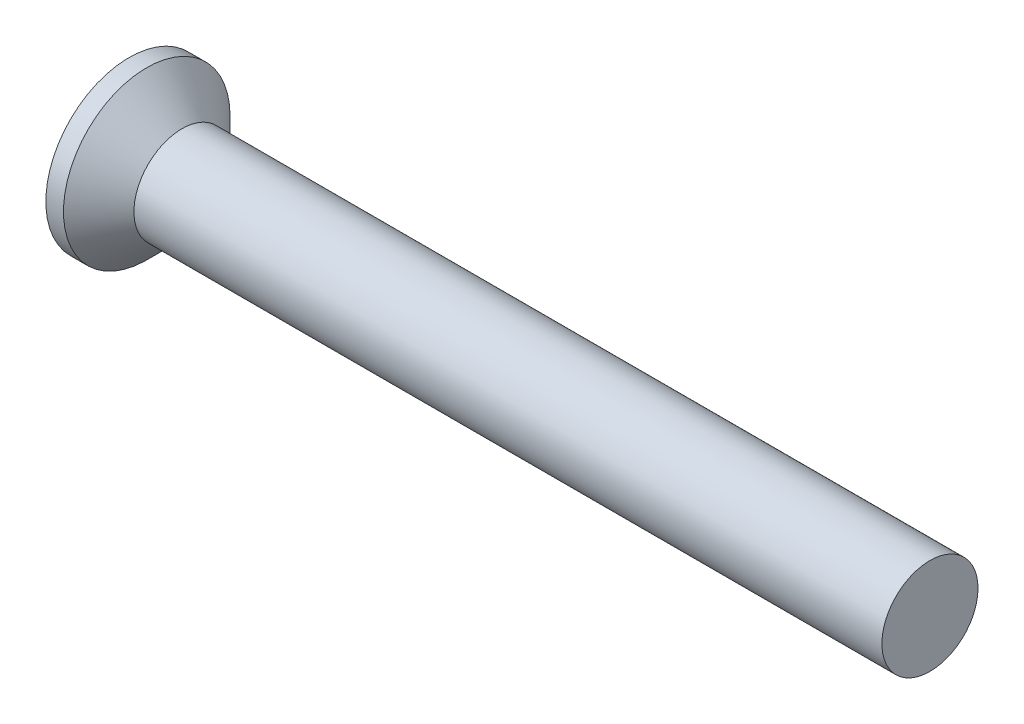
ISO-10303-21;
HEADER;
FILE_DESCRIPTION(('STEP AP214'),'2;1');
FILE_NAME('part.step','',(''),(''),'','','');
FILE_SCHEMA(('AUTOMOTIVE_DESIGN { 1 0 10303 214 1 1 1 1 }'));
ENDSEC;
DATA;
#1=APPLICATION_CONTEXT('core data for automotive mechanical design processes');
#2=APPLICATION_PROTOCOL_DEFINITION('international standard','automotive_design',2000,#1);
#3=PRODUCT_CONTEXT('',#1,'mechanical');
#4=PRODUCT('Part','Part','',(#3));
#5=PRODUCT_RELATED_PRODUCT_CATEGORY('part','',(#4));
#6=PRODUCT_DEFINITION_FORMATION('','',#4);
#7=PRODUCT_DEFINITION_CONTEXT('part definition',#1,'design');
#8=PRODUCT_DEFINITION('design','',#6,#7);
#9=PRODUCT_DEFINITION_SHAPE('','',#8);
#10=(LENGTH_UNIT() NAMED_UNIT(*) SI_UNIT(.MILLI.,.METRE.));
#11=(NAMED_UNIT(*) PLANE_ANGLE_UNIT() SI_UNIT($,.RADIAN.));
#12=(NAMED_UNIT(*) SI_UNIT($,.STERADIAN.) SOLID_ANGLE_UNIT());
#13=UNCERTAINTY_MEASURE_WITH_UNIT(LENGTH_MEASURE(1.E-05),#10,'distance_accuracy_value','');
#14=(GEOMETRIC_REPRESENTATION_CONTEXT(3) GLOBAL_UNCERTAINTY_ASSIGNED_CONTEXT((#13)) GLOBAL_UNIT_ASSIGNED_CONTEXT((#10,
#11,#12)) REPRESENTATION_CONTEXT('',''));
#15=CARTESIAN_POINT('',(0.,0.,0.));
#16=DIRECTION('',(0.,0.,1.));
#17=DIRECTION('',(1.,0.,0.));
#18=AXIS2_PLACEMENT_3D('',#15,#16,#17);
#19=CARTESIAN_POINT('',(0.,2.6,0.));
#20=DIRECTION('',(-1.,0.,0.));
#21=DIRECTION('',(0.,0.,1.));
#22=AXIS2_PLACEMENT_3D('',#19,#20,#21);
#23=PLANE('',#22);
#24=CARTESIAN_POINT('',(0.,0.,0.));
#25=DIRECTION('',(1.,0.,0.));
#26=DIRECTION('',(0.,0.,-1.));
#27=AXIS2_PLACEMENT_3D('',#24,#25,#26);
#28=CIRCLE('',#27,2.6);
#29=CARTESIAN_POINT('',(0.,0.,-2.6));
#30=VERTEX_POINT('',#29);
#31=EDGE_CURVE('E205',#30,#30,#28,.T.);
#32=ORIENTED_EDGE('',*,*,#31,.F.);
#33=EDGE_LOOP('',(#32));
#34=FACE_BOUND('',#33,.T.);
#35=DIRECTION('',(0.,1.,0.));
#36=VECTOR('',#35,1.);
#37=CARTESIAN_POINT('',(0.,-0.32,-0.32));
#38=LINE('',#37,#36);
#39=CARTESIAN_POINT('',(0.,-1.6,-0.32));
#40=VERTEX_POINT('',#39);
#41=CARTESIAN_POINT('',(0.,-0.62,-0.32));
#42=VERTEX_POINT('',#41);
#43=EDGE_CURVE('E354',#40,#42,#38,.T.);
#44=ORIENTED_EDGE('',*,*,#43,.T.);
#45=CARTESIAN_POINT('',(0.,-0.62,-0.62));
#46=DIRECTION('',(-1.,0.,0.));
#47=DIRECTION('',(0.,0.,1.));
#48=AXIS2_PLACEMENT_3D('',#45,#46,#47);
#49=CIRCLE('',#48,0.3);
#50=CARTESIAN_POINT('',(0.,-0.32,-0.62));
#51=VERTEX_POINT('',#50);
#52=EDGE_CURVE('E213',#42,#51,#49,.T.);
#53=ORIENTED_EDGE('',*,*,#52,.T.);
#54=DIRECTION('',(0.,0.,-1.));
#55=VECTOR('',#54,1.);
#56=CARTESIAN_POINT('',(0.,-0.32,-0.32));
#57=LINE('',#56,#55);
#58=CARTESIAN_POINT('',(0.,-0.32,-1.6));
#59=VERTEX_POINT('',#58);
#60=EDGE_CURVE('E357',#51,#59,#57,.T.);
#61=ORIENTED_EDGE('',*,*,#60,.T.);
#62=DIRECTION('',(0.,1.,0.));
#63=VECTOR('',#62,1.);
#64=CARTESIAN_POINT('',(0.,0.32,-1.6));
#65=LINE('',#64,#63);
#66=CARTESIAN_POINT('',(0.,0.32,-1.6));
#67=VERTEX_POINT('',#66);
#68=EDGE_CURVE('E360',#59,#67,#65,.T.);
#69=ORIENTED_EDGE('',*,*,#68,.T.);
#70=DIRECTION('',(0.,0.,1.));
#71=VECTOR('',#70,1.);
#72=CARTESIAN_POINT('',(0.,0.32,-0.32));
#73=LINE('',#72,#71);
#74=CARTESIAN_POINT('',(0.,0.32,-0.62));
#75=VERTEX_POINT('',#74);
#76=EDGE_CURVE('E364',#67,#75,#73,.T.);
#77=ORIENTED_EDGE('',*,*,#76,.T.);
#78=CARTESIAN_POINT('',(0.,0.62,-0.62));
#79=DIRECTION('',(-1.,0.,0.));
#80=DIRECTION('',(0.,0.,1.));
#81=AXIS2_PLACEMENT_3D('',#78,#79,#80);
#82=CIRCLE('',#81,0.3);
#83=CARTESIAN_POINT('',(0.,0.62,-0.32));
#84=VERTEX_POINT('',#83);
#85=EDGE_CURVE('E210',#75,#84,#82,.T.);
#86=ORIENTED_EDGE('',*,*,#85,.T.);
#87=DIRECTION('',(0.,1.,0.));
#88=VECTOR('',#87,1.);
#89=CARTESIAN_POINT('',(0.,0.32,-0.32));
#90=LINE('',#89,#88);
#91=CARTESIAN_POINT('',(0.,1.6,-0.32));
#92=VERTEX_POINT('',#91);
#93=EDGE_CURVE('E368',#84,#92,#90,.T.);
#94=ORIENTED_EDGE('',*,*,#93,.T.);
#95=DIRECTION('',(0.,0.,1.));
#96=VECTOR('',#95,1.);
#97=CARTESIAN_POINT('',(0.,1.6,-0.32));
#98=LINE('',#97,#96);
#99=CARTESIAN_POINT('',(0.,1.6,0.32));
#100=VERTEX_POINT('',#99);
#101=EDGE_CURVE('E371',#92,#100,#98,.T.);
#102=ORIENTED_EDGE('',*,*,#101,.T.);
#103=DIRECTION('',(0.,-1.,0.));
#104=VECTOR('',#103,1.);
#105=CARTESIAN_POINT('',(0.,0.32,0.32));
#106=LINE('',#105,#104);
#107=CARTESIAN_POINT('',(0.,0.62,0.32));
#108=VERTEX_POINT('',#107);
#109=EDGE_CURVE('E375',#100,#108,#106,.T.);
#110=ORIENTED_EDGE('',*,*,#109,.T.);
#111=CARTESIAN_POINT('',(0.,0.62,0.62));
#112=DIRECTION('',(-1.,0.,0.));
#113=DIRECTION('',(0.,0.,1.));
#114=AXIS2_PLACEMENT_3D('',#111,#112,#113);
#115=CIRCLE('',#114,0.3);
#116=CARTESIAN_POINT('',(0.,0.32,0.62));
#117=VERTEX_POINT('',#116);
#118=EDGE_CURVE('E167',#108,#117,#115,.T.);
#119=ORIENTED_EDGE('',*,*,#118,.T.);
#120=DIRECTION('',(0.,0.,1.));
#121=VECTOR('',#120,1.);
#122=CARTESIAN_POINT('',(0.,0.32,0.32));
#123=LINE('',#122,#121);
#124=CARTESIAN_POINT('',(0.,0.32,1.6));
#125=VERTEX_POINT('',#124);
#126=EDGE_CURVE('E161',#117,#125,#123,.T.);
#127=ORIENTED_EDGE('',*,*,#126,.T.);
#128=DIRECTION('',(0.,-1.,0.));
#129=VECTOR('',#128,1.);
#130=CARTESIAN_POINT('',(0.,0.32,1.6));
#131=LINE('',#130,#129);
#132=CARTESIAN_POINT('',(0.,-0.32,1.6));
#133=VERTEX_POINT('',#132);
#134=EDGE_CURVE('E165',#125,#133,#131,.T.);
#135=ORIENTED_EDGE('',*,*,#134,.T.);
#136=DIRECTION('',(0.,0.,-1.));
#137=VECTOR('',#136,1.);
#138=CARTESIAN_POINT('',(0.,-0.32,0.32));
#139=LINE('',#138,#137);
#140=CARTESIAN_POINT('',(0.,-0.32,0.62));
#141=VERTEX_POINT('',#140);
#142=EDGE_CURVE('E181',#133,#141,#139,.T.);
#143=ORIENTED_EDGE('',*,*,#142,.T.);
#144=CARTESIAN_POINT('',(0.,-0.62,0.62));
#145=DIRECTION('',(-1.,0.,0.));
#146=DIRECTION('',(0.,0.,1.));
#147=AXIS2_PLACEMENT_3D('',#144,#145,#146);
#148=CIRCLE('',#147,0.3);
#149=CARTESIAN_POINT('',(0.,-0.62,0.32));
#150=VERTEX_POINT('',#149);
#151=EDGE_CURVE('E204',#141,#150,#148,.T.);
#152=ORIENTED_EDGE('',*,*,#151,.T.);
#153=DIRECTION('',(0.,-1.,0.));
#154=VECTOR('',#153,1.);
#155=CARTESIAN_POINT('',(0.,-0.32,0.32));
#156=LINE('',#155,#154);
#157=CARTESIAN_POINT('',(0.,-1.6,0.32));
#158=VERTEX_POINT('',#157);
#159=EDGE_CURVE('E347',#150,#158,#156,.T.);
#160=ORIENTED_EDGE('',*,*,#159,.T.);
#161=DIRECTION('',(0.,0.,-1.));
#162=VECTOR('',#161,1.);
#163=CARTESIAN_POINT('',(0.,-1.6,-0.32));
#164=LINE('',#163,#162);
#165=EDGE_CURVE('E350',#158,#40,#164,.T.);
#166=ORIENTED_EDGE('',*,*,#165,.T.);
#167=EDGE_LOOP('',(#44,#53,#61,#69,#77,#86,#94,#102,#110,#119,#127,#135,#143,#152,#160,#166));
#168=FACE_BOUND('',#167,.T.);
#169=ADVANCED_FACE('F47',(#34,#168),#23,.T.);
#170=CARTESIAN_POINT('',(25.,1.5,0.));
#171=DIRECTION('',(1.,0.,0.));
#172=DIRECTION('',(0.,0.,-1.));
#173=AXIS2_PLACEMENT_3D('',#170,#171,#172);
#174=PLANE('',#173);
#175=CARTESIAN_POINT('',(25.,0.,0.));
#176=DIRECTION('',(1.,0.,0.));
#177=DIRECTION('',(0.,0.,-1.));
#178=AXIS2_PLACEMENT_3D('',#175,#176,#177);
#179=CIRCLE('',#178,1.5);
#180=CARTESIAN_POINT('',(25.,0.,-1.5));
#181=VERTEX_POINT('',#180);
#182=EDGE_CURVE('E188',#181,#181,#179,.T.);
#183=ORIENTED_EDGE('',*,*,#182,.T.);
#184=EDGE_LOOP('',(#183));
#185=FACE_BOUND('',#184,.T.);
#186=ADVANCED_FACE('F273',(#185),#174,.T.);
#187=CARTESIAN_POINT('',(4.51581291088132,0.,0.));
#188=DIRECTION('',(1.,0.,0.));
#189=DIRECTION('',(0.,0.,-1.));
#190=AXIS2_PLACEMENT_3D('',#187,#188,#189);
#191=CYLINDRICAL_SURFACE('',#190,2.6);
#192=ORIENTED_EDGE('',*,*,#31,.T.);
#193=EDGE_LOOP('',(#192));
#194=FACE_BOUND('',#193,.T.);
#195=CARTESIAN_POINT('',(0.550000000000004,0.,0.));
#196=DIRECTION('',(1.,0.,0.));
#197=DIRECTION('',(0.,0.,-1.));
#198=AXIS2_PLACEMENT_3D('',#195,#196,#197);
#199=CIRCLE('',#198,2.6);
#200=CARTESIAN_POINT('',(0.550000000000004,0.,-2.6));
#201=VERTEX_POINT('',#200);
#202=EDGE_CURVE('E381',#201,#201,#199,.T.);
#203=ORIENTED_EDGE('',*,*,#202,.F.);
#204=EDGE_LOOP('',(#203));
#205=FACE_BOUND('',#204,.T.);
#206=ADVANCED_FACE('F279',(#194,#205),#191,.T.);
#207=CARTESIAN_POINT('',(1.65,0.,0.));
#208=DIRECTION('',(-1.,0.,0.));
#209=DIRECTION('',(0.,0.,1.));
#210=AXIS2_PLACEMENT_3D('',#207,#208,#209);
#211=CONICAL_SURFACE('',#210,1.5,0.78539816339745);
#212=ORIENTED_EDGE('',*,*,#202,.T.);
#213=EDGE_LOOP('',(#212));
#214=FACE_BOUND('',#213,.T.);
#215=CARTESIAN_POINT('',(1.65,0.,0.));
#216=DIRECTION('',(1.,0.,0.));
#217=DIRECTION('',(0.,0.,-1.));
#218=AXIS2_PLACEMENT_3D('',#215,#216,#217);
#219=CIRCLE('',#218,1.5);
#220=CARTESIAN_POINT('',(1.65,0.,-1.5));
#221=VERTEX_POINT('',#220);
#222=EDGE_CURVE('E193',#221,#221,#219,.T.);
#223=ORIENTED_EDGE('',*,*,#222,.F.);
#224=EDGE_LOOP('',(#223));
#225=FACE_BOUND('',#224,.T.);
#226=ADVANCED_FACE('F431',(#214,#225),#211,.T.);
#227=CARTESIAN_POINT('',(4.51581291088132,0.,0.));
#228=DIRECTION('',(1.,0.,0.));
#229=DIRECTION('',(0.,0.,-1.));
#230=AXIS2_PLACEMENT_3D('',#227,#228,#229);
#231=CYLINDRICAL_SURFACE('',#230,1.5);
#232=ORIENTED_EDGE('',*,*,#222,.T.);
#233=EDGE_LOOP('',(#232));
#234=FACE_BOUND('',#233,.T.);
#235=ORIENTED_EDGE('',*,*,#182,.F.);
#236=EDGE_LOOP('',(#235));
#237=FACE_BOUND('',#236,.T.);
#238=ADVANCED_FACE('F429',(#234,#237),#231,.T.);
#239=CARTESIAN_POINT('',(0.825,0.32,0.32));
#240=DIRECTION('',(0.,-1.,0.));
#241=DIRECTION('',(0.,0.,-1.));
#242=AXIS2_PLACEMENT_3D('',#239,#240,#241);
#243=PLANE('',#242);
#244=ORIENTED_EDGE('',*,*,#126,.F.);
#245=DIRECTION('',(-1.,0.,0.));
#246=VECTOR('',#245,1.);
#247=CARTESIAN_POINT('',(0.825,0.32,0.62));
#248=LINE('',#247,#246);
#249=CARTESIAN_POINT('',(0.825,0.32,0.62));
#250=VERTEX_POINT('',#249);
#251=EDGE_CURVE('E230',#117,#250,#248,.F.);
#252=ORIENTED_EDGE('',*,*,#251,.T.);
#253=DIRECTION('',(0.,0.,1.));
#254=VECTOR('',#253,1.);
#255=CARTESIAN_POINT('',(0.825,0.32,0.32));
#256=LINE('',#255,#254);
#257=CARTESIAN_POINT('',(0.825,0.32,1.12368602791856));
#258=VERTEX_POINT('',#257);
#259=EDGE_CURVE('E185',#250,#258,#256,.T.);
#260=ORIENTED_EDGE('',*,*,#259,.T.);
#261=DIRECTION('',(-0.866025403784438,0.,0.500000000000001));
#262=VECTOR('',#261,1.);
#263=CARTESIAN_POINT('',(0.,0.32,1.6));
#264=LINE('',#263,#262);
#265=EDGE_CURVE('E176',#258,#125,#264,.T.);
#266=ORIENTED_EDGE('',*,*,#265,.T.);
#267=EDGE_LOOP('',(#244,#252,#260,#266));
#268=FACE_BOUND('',#267,.T.);
#269=ADVANCED_FACE('F183',(#268),#243,.T.);
#270=CARTESIAN_POINT('',(0.,0.32,1.6));
#271=DIRECTION('',(-0.500000000000001,0.,-0.866025403784438));
#272=DIRECTION('',(-0.866025403784438,0.,0.500000000000001));
#273=AXIS2_PLACEMENT_3D('',#270,#271,#272);
#274=PLANE('',#273);
#275=ORIENTED_EDGE('',*,*,#134,.F.);
#276=ORIENTED_EDGE('',*,*,#265,.F.);
#277=DIRECTION('',(0.,-1.,0.));
#278=VECTOR('',#277,1.);
#279=CARTESIAN_POINT('',(0.825,0.32,1.12368602791856));
#280=LINE('',#279,#278);
#281=CARTESIAN_POINT('',(0.825,-0.32,1.12368602791856));
#282=VERTEX_POINT('',#281);
#283=EDGE_CURVE('E199',#258,#282,#280,.T.);
#284=ORIENTED_EDGE('',*,*,#283,.T.);
#285=DIRECTION('',(-0.866025403784438,0.,0.500000000000001));
#286=VECTOR('',#285,1.);
#287=CARTESIAN_POINT('',(1.17300625842204,-0.32,0.922764520938917));
#288=LINE('',#287,#286);
#289=EDGE_CURVE('E178',#282,#133,#288,.T.);
#290=ORIENTED_EDGE('',*,*,#289,.T.);
#291=EDGE_LOOP('',(#275,#276,#284,#290));
#292=FACE_BOUND('',#291,.T.);
#293=ADVANCED_FACE('F175',(#292),#274,.T.);
#294=CARTESIAN_POINT('',(0.825,-0.32,0.32));
#295=DIRECTION('',(0.,1.,0.));
#296=DIRECTION('',(0.,0.,1.));
#297=AXIS2_PLACEMENT_3D('',#294,#295,#296);
#298=PLANE('',#297);
#299=DIRECTION('',(0.,0.,-1.));
#300=VECTOR('',#299,1.);
#301=CARTESIAN_POINT('',(0.825,-0.32,0.32));
#302=LINE('',#301,#300);
#303=CARTESIAN_POINT('',(0.825,-0.32,0.62));
#304=VERTEX_POINT('',#303);
#305=EDGE_CURVE('E413',#282,#304,#302,.T.);
#306=ORIENTED_EDGE('',*,*,#305,.T.);
#307=DIRECTION('',(-1.,0.,0.));
#308=VECTOR('',#307,1.);
#309=CARTESIAN_POINT('',(0.825,-0.32,0.62));
#310=LINE('',#309,#308);
#311=EDGE_CURVE('E233',#304,#141,#310,.T.);
#312=ORIENTED_EDGE('',*,*,#311,.T.);
#313=ORIENTED_EDGE('',*,*,#142,.F.);
#314=ORIENTED_EDGE('',*,*,#289,.F.);
#315=EDGE_LOOP('',(#306,#312,#313,#314));
#316=FACE_BOUND('',#315,.T.);
#317=ADVANCED_FACE('F293',(#316),#298,.T.);
#318=CARTESIAN_POINT('',(0.825,-0.32,0.32));
#319=DIRECTION('',(0.,0.,-1.));
#320=DIRECTION('',(0.,1.,0.));
#321=AXIS2_PLACEMENT_3D('',#318,#319,#320);
#322=PLANE('',#321);
#323=ORIENTED_EDGE('',*,*,#159,.F.);
#324=DIRECTION('',(-1.,0.,0.));
#325=VECTOR('',#324,1.);
#326=CARTESIAN_POINT('',(0.825,-0.62,0.32));
#327=LINE('',#326,#325);
#328=CARTESIAN_POINT('',(0.825,-0.62,0.32));
#329=VERTEX_POINT('',#328);
#330=EDGE_CURVE('E63',#150,#329,#327,.F.);
#331=ORIENTED_EDGE('',*,*,#330,.T.);
#332=DIRECTION('',(0.,-1.,0.));
#333=VECTOR('',#332,1.);
#334=CARTESIAN_POINT('',(0.825,-0.32,0.32));
#335=LINE('',#334,#333);
#336=CARTESIAN_POINT('',(0.825,-1.12368602791856,0.32));
#337=VERTEX_POINT('',#336);
#338=EDGE_CURVE('E333',#329,#337,#335,.T.);
#339=ORIENTED_EDGE('',*,*,#338,.T.);
#340=DIRECTION('',(-0.866025403784438,-0.500000000000001,0.));
#341=VECTOR('',#340,1.);
#342=CARTESIAN_POINT('',(0.,-1.6,0.32));
#343=LINE('',#342,#341);
#344=EDGE_CURVE('E195',#337,#158,#343,.T.);
#345=ORIENTED_EDGE('',*,*,#344,.T.);
#346=EDGE_LOOP('',(#323,#331,#339,#345));
#347=FACE_BOUND('',#346,.T.);
#348=ADVANCED_FACE('F298',(#347),#322,.T.);
#349=CARTESIAN_POINT('',(0.,-1.6,-0.32));
#350=DIRECTION('',(-0.500000000000001,0.866025403784438,0.));
#351=DIRECTION('',(-0.866025403784438,-0.500000000000001,0.));
#352=AXIS2_PLACEMENT_3D('',#349,#350,#351);
#353=PLANE('',#352);
#354=ORIENTED_EDGE('',*,*,#165,.F.);
#355=ORIENTED_EDGE('',*,*,#344,.F.);
#356=DIRECTION('',(0.,0.,-1.));
#357=VECTOR('',#356,1.);
#358=CARTESIAN_POINT('',(0.825,-1.12368602791856,0.32));
#359=LINE('',#358,#357);
#360=CARTESIAN_POINT('',(0.825,-1.12368602791856,-0.32));
#361=VERTEX_POINT('',#360);
#362=EDGE_CURVE('E327',#337,#361,#359,.T.);
#363=ORIENTED_EDGE('',*,*,#362,.T.);
#364=DIRECTION('',(-0.866025403784438,-0.500000000000001,0.));
#365=VECTOR('',#364,1.);
#366=CARTESIAN_POINT('',(1.17300625842204,-0.922764520938918,-0.32));
#367=LINE('',#366,#365);
#368=EDGE_CURVE('E325',#361,#40,#367,.T.);
#369=ORIENTED_EDGE('',*,*,#368,.T.);
#370=EDGE_LOOP('',(#354,#355,#363,#369));
#371=FACE_BOUND('',#370,.T.);
#372=ADVANCED_FACE('F294',(#371),#353,.T.);
#373=CARTESIAN_POINT('',(0.825,-0.32,-0.32));
#374=DIRECTION('',(0.,0.,1.));
#375=DIRECTION('',(1.,0.,0.));
#376=AXIS2_PLACEMENT_3D('',#373,#374,#375);
#377=PLANE('',#376);
#378=DIRECTION('',(0.,1.,0.));
#379=VECTOR('',#378,1.);
#380=CARTESIAN_POINT('',(0.825,-0.32,-0.32));
#381=LINE('',#380,#379);
#382=CARTESIAN_POINT('',(0.825,-0.62,-0.32));
#383=VERTEX_POINT('',#382);
#384=EDGE_CURVE('E319',#361,#383,#381,.T.);
#385=ORIENTED_EDGE('',*,*,#384,.T.);
#386=DIRECTION('',(-1.,0.,0.));
#387=VECTOR('',#386,1.);
#388=CARTESIAN_POINT('',(0.825,-0.62,-0.32));
#389=LINE('',#388,#387);
#390=EDGE_CURVE('E200',#383,#42,#389,.T.);
#391=ORIENTED_EDGE('',*,*,#390,.T.);
#392=ORIENTED_EDGE('',*,*,#43,.F.);
#393=ORIENTED_EDGE('',*,*,#368,.F.);
#394=EDGE_LOOP('',(#385,#391,#392,#393));
#395=FACE_BOUND('',#394,.T.);
#396=ADVANCED_FACE('F297',(#395),#377,.T.);
#397=CARTESIAN_POINT('',(0.825,-0.32,-0.32));
#398=DIRECTION('',(0.,1.,0.));
#399=DIRECTION('',(0.,0.,1.));
#400=AXIS2_PLACEMENT_3D('',#397,#398,#399);
#401=PLANE('',#400);
#402=ORIENTED_EDGE('',*,*,#60,.F.);
#403=DIRECTION('',(-1.,0.,0.));
#404=VECTOR('',#403,1.);
#405=CARTESIAN_POINT('',(0.825,-0.32,-0.62));
#406=LINE('',#405,#404);
#407=CARTESIAN_POINT('',(0.825,-0.32,-0.62));
#408=VERTEX_POINT('',#407);
#409=EDGE_CURVE('E216',#51,#408,#406,.F.);
#410=ORIENTED_EDGE('',*,*,#409,.T.);
#411=DIRECTION('',(0.,0.,-1.));
#412=VECTOR('',#411,1.);
#413=CARTESIAN_POINT('',(0.825,-0.32,-0.32));
#414=LINE('',#413,#412);
#415=CARTESIAN_POINT('',(0.825,-0.32,-1.12368602791856));
#416=VERTEX_POINT('',#415);
#417=EDGE_CURVE('E321',#408,#416,#414,.T.);
#418=ORIENTED_EDGE('',*,*,#417,.T.);
#419=DIRECTION('',(-0.866025403784438,0.,-0.500000000000001));
#420=VECTOR('',#419,1.);
#421=CARTESIAN_POINT('',(0.,-0.32,-1.6));
#422=LINE('',#421,#420);
#423=EDGE_CURVE('E399',#416,#59,#422,.T.);
#424=ORIENTED_EDGE('',*,*,#423,.T.);
#425=EDGE_LOOP('',(#402,#410,#418,#424));
#426=FACE_BOUND('',#425,.T.);
#427=ADVANCED_FACE('F304',(#426),#401,.T.);
#428=CARTESIAN_POINT('',(0.,0.32,-1.6));
#429=DIRECTION('',(-0.500000000000001,0.,0.866025403784438));
#430=DIRECTION('',(0.866025403784438,0.,0.500000000000001));
#431=AXIS2_PLACEMENT_3D('',#428,#429,#430);
#432=PLANE('',#431);
#433=ORIENTED_EDGE('',*,*,#68,.F.);
#434=ORIENTED_EDGE('',*,*,#423,.F.);
#435=DIRECTION('',(0.,1.,0.));
#436=VECTOR('',#435,1.);
#437=CARTESIAN_POINT('',(0.825,0.32,-1.12368602791856));
#438=LINE('',#437,#436);
#439=CARTESIAN_POINT('',(0.825,0.32,-1.12368602791856));
#440=VERTEX_POINT('',#439);
#441=EDGE_CURVE('E331',#416,#440,#438,.T.);
#442=ORIENTED_EDGE('',*,*,#441,.T.);
#443=DIRECTION('',(-0.866025403784438,0.,-0.500000000000001));
#444=VECTOR('',#443,1.);
#445=CARTESIAN_POINT('',(1.17300625842204,0.32,-0.922764520938918));
#446=LINE('',#445,#444);
#447=EDGE_CURVE('E396',#440,#67,#446,.T.);
#448=ORIENTED_EDGE('',*,*,#447,.T.);
#449=EDGE_LOOP('',(#433,#434,#442,#448));
#450=FACE_BOUND('',#449,.T.);
#451=ADVANCED_FACE('F300',(#450),#432,.T.);
#452=CARTESIAN_POINT('',(0.825,0.32,-0.32));
#453=DIRECTION('',(0.,-1.,0.));
#454=DIRECTION('',(0.,0.,-1.));
#455=AXIS2_PLACEMENT_3D('',#452,#453,#454);
#456=PLANE('',#455);
#457=DIRECTION('',(0.,0.,1.));
#458=VECTOR('',#457,1.);
#459=CARTESIAN_POINT('',(0.825,0.32,-0.32));
#460=LINE('',#459,#458);
#461=CARTESIAN_POINT('',(0.825,0.32,-0.62));
#462=VERTEX_POINT('',#461);
#463=EDGE_CURVE('E338',#440,#462,#460,.T.);
#464=ORIENTED_EDGE('',*,*,#463,.T.);
#465=DIRECTION('',(-1.,0.,0.));
#466=VECTOR('',#465,1.);
#467=CARTESIAN_POINT('',(0.825,0.32,-0.62));
#468=LINE('',#467,#466);
#469=EDGE_CURVE('E219',#462,#75,#468,.T.);
#470=ORIENTED_EDGE('',*,*,#469,.T.);
#471=ORIENTED_EDGE('',*,*,#76,.F.);
#472=ORIENTED_EDGE('',*,*,#447,.F.);
#473=EDGE_LOOP('',(#464,#470,#471,#472));
#474=FACE_BOUND('',#473,.T.);
#475=ADVANCED_FACE('F303',(#474),#456,.T.);
#476=CARTESIAN_POINT('',(0.825,0.32,-0.32));
#477=DIRECTION('',(0.,0.,1.));
#478=DIRECTION('',(1.,0.,0.));
#479=AXIS2_PLACEMENT_3D('',#476,#477,#478);
#480=PLANE('',#479);
#481=ORIENTED_EDGE('',*,*,#93,.F.);
#482=DIRECTION('',(-1.,0.,0.));
#483=VECTOR('',#482,1.);
#484=CARTESIAN_POINT('',(0.825,0.62,-0.32));
#485=LINE('',#484,#483);
#486=CARTESIAN_POINT('',(0.825,0.62,-0.32));
#487=VERTEX_POINT('',#486);
#488=EDGE_CURVE('E223',#84,#487,#485,.F.);
#489=ORIENTED_EDGE('',*,*,#488,.T.);
#490=DIRECTION('',(0.,1.,0.));
#491=VECTOR('',#490,1.);
#492=CARTESIAN_POINT('',(0.825,0.32,-0.32));
#493=LINE('',#492,#491);
#494=CARTESIAN_POINT('',(0.825,1.12368602791856,-0.32));
#495=VERTEX_POINT('',#494);
#496=EDGE_CURVE('E342',#487,#495,#493,.T.);
#497=ORIENTED_EDGE('',*,*,#496,.T.);
#498=DIRECTION('',(-0.866025403784438,0.500000000000001,0.));
#499=VECTOR('',#498,1.);
#500=CARTESIAN_POINT('',(0.,1.6,-0.32));
#501=LINE('',#500,#499);
#502=EDGE_CURVE('E390',#495,#92,#501,.T.);
#503=ORIENTED_EDGE('',*,*,#502,.T.);
#504=EDGE_LOOP('',(#481,#489,#497,#503));
#505=FACE_BOUND('',#504,.T.);
#506=ADVANCED_FACE('F289',(#505),#480,.T.);
#507=CARTESIAN_POINT('',(0.,1.6,-0.32));
#508=DIRECTION('',(-0.500000000000001,-0.866025403784438,0.));
#509=DIRECTION('',(0.866025403784438,-0.500000000000001,0.));
#510=AXIS2_PLACEMENT_3D('',#507,#508,#509);
#511=PLANE('',#510);
#512=ORIENTED_EDGE('',*,*,#101,.F.);
#513=ORIENTED_EDGE('',*,*,#502,.F.);
#514=DIRECTION('',(0.,0.,1.));
#515=VECTOR('',#514,1.);
#516=CARTESIAN_POINT('',(0.825,1.12368602791856,0.32));
#517=LINE('',#516,#515);
#518=CARTESIAN_POINT('',(0.825,1.12368602791856,0.32));
#519=VERTEX_POINT('',#518);
#520=EDGE_CURVE('E259',#495,#519,#517,.T.);
#521=ORIENTED_EDGE('',*,*,#520,.T.);
#522=DIRECTION('',(-0.866025403784438,0.500000000000001,0.));
#523=VECTOR('',#522,1.);
#524=CARTESIAN_POINT('',(1.17300625842204,0.922764520938918,0.32));
#525=LINE('',#524,#523);
#526=EDGE_CURVE('E257',#519,#100,#525,.T.);
#527=ORIENTED_EDGE('',*,*,#526,.T.);
#528=EDGE_LOOP('',(#512,#513,#521,#527));
#529=FACE_BOUND('',#528,.T.);
#530=ADVANCED_FACE('F286',(#529),#511,.T.);
#531=CARTESIAN_POINT('',(0.825,0.32,0.32));
#532=DIRECTION('',(0.,0.,-1.));
#533=DIRECTION('',(0.,1.,0.));
#534=AXIS2_PLACEMENT_3D('',#531,#532,#533);
#535=PLANE('',#534);
#536=DIRECTION('',(0.,-1.,0.));
#537=VECTOR('',#536,1.);
#538=CARTESIAN_POINT('',(0.825,0.32,0.32));
#539=LINE('',#538,#537);
#540=CARTESIAN_POINT('',(0.825,0.62,0.32));
#541=VERTEX_POINT('',#540);
#542=EDGE_CURVE('E250',#519,#541,#539,.T.);
#543=ORIENTED_EDGE('',*,*,#542,.T.);
#544=DIRECTION('',(-1.,0.,0.));
#545=VECTOR('',#544,1.);
#546=CARTESIAN_POINT('',(0.825,0.62,0.32));
#547=LINE('',#546,#545);
#548=EDGE_CURVE('E226',#541,#108,#547,.T.);
#549=ORIENTED_EDGE('',*,*,#548,.T.);
#550=ORIENTED_EDGE('',*,*,#109,.F.);
#551=ORIENTED_EDGE('',*,*,#526,.F.);
#552=EDGE_LOOP('',(#543,#549,#550,#551));
#553=FACE_BOUND('',#552,.T.);
#554=ADVANCED_FACE('F255',(#553),#535,.T.);
#555=CARTESIAN_POINT('',(0.825,0.32,0.32));
#556=DIRECTION('',(-1.,0.,0.));
#557=DIRECTION('',(0.,0.,1.));
#558=AXIS2_PLACEMENT_3D('',#555,#556,#557);
#559=PLANE('',#558);
#560=ORIENTED_EDGE('',*,*,#259,.F.);
#561=CARTESIAN_POINT('',(0.825,0.62,0.62));
#562=DIRECTION('',(-1.,0.,0.));
#563=DIRECTION('',(0.,0.,1.));
#564=AXIS2_PLACEMENT_3D('',#561,#562,#563);
#565=CIRCLE('',#564,0.3);
#566=EDGE_CURVE('E56',#250,#541,#565,.F.);
#567=ORIENTED_EDGE('',*,*,#566,.T.);
#568=ORIENTED_EDGE('',*,*,#542,.F.);
#569=ORIENTED_EDGE('',*,*,#520,.F.);
#570=ORIENTED_EDGE('',*,*,#496,.F.);
#571=CARTESIAN_POINT('',(0.825,0.62,-0.62));
#572=DIRECTION('',(-1.,0.,0.));
#573=DIRECTION('',(0.,0.,1.));
#574=AXIS2_PLACEMENT_3D('',#571,#572,#573);
#575=CIRCLE('',#574,0.3);
#576=EDGE_CURVE('E242',#487,#462,#575,.F.);
#577=ORIENTED_EDGE('',*,*,#576,.T.);
#578=ORIENTED_EDGE('',*,*,#463,.F.);
#579=ORIENTED_EDGE('',*,*,#441,.F.);
#580=ORIENTED_EDGE('',*,*,#417,.F.);
#581=CARTESIAN_POINT('',(0.825,-0.62,-0.62));
#582=DIRECTION('',(-1.,0.,0.));
#583=DIRECTION('',(0.,0.,1.));
#584=AXIS2_PLACEMENT_3D('',#581,#582,#583);
#585=CIRCLE('',#584,0.3);
#586=EDGE_CURVE('E239',#408,#383,#585,.F.);
#587=ORIENTED_EDGE('',*,*,#586,.T.);
#588=ORIENTED_EDGE('',*,*,#384,.F.);
#589=ORIENTED_EDGE('',*,*,#362,.F.);
#590=ORIENTED_EDGE('',*,*,#338,.F.);
#591=CARTESIAN_POINT('',(0.825,-0.62,0.62));
#592=DIRECTION('',(-1.,0.,0.));
#593=DIRECTION('',(0.,0.,1.));
#594=AXIS2_PLACEMENT_3D('',#591,#592,#593);
#595=CIRCLE('',#594,0.3);
#596=EDGE_CURVE('E11',#329,#304,#595,.F.);
#597=ORIENTED_EDGE('',*,*,#596,.T.);
#598=ORIENTED_EDGE('',*,*,#305,.F.);
#599=ORIENTED_EDGE('',*,*,#283,.F.);
#600=EDGE_LOOP('',(#560,#567,#568,#569,#570,#577,#578,#579,#580,#587,#588,#589,#590,#597,#598,#599));
#601=FACE_BOUND('',#600,.T.);
#602=ADVANCED_FACE('F248',(#601),#559,.T.);
#603=CARTESIAN_POINT('',(0.825,-0.62,-0.62));
#604=DIRECTION('',(-1.,0.,0.));
#605=DIRECTION('',(0.,0.,1.));
#606=AXIS2_PLACEMENT_3D('',#603,#604,#605);
#607=CYLINDRICAL_SURFACE('',#606,0.3);
#608=ORIENTED_EDGE('',*,*,#586,.F.);
#609=ORIENTED_EDGE('',*,*,#409,.F.);
#610=ORIENTED_EDGE('',*,*,#52,.F.);
#611=ORIENTED_EDGE('',*,*,#390,.F.);
#612=EDGE_LOOP('',(#608,#609,#610,#611));
#613=FACE_BOUND('',#612,.T.);
#614=ADVANCED_FACE('F269',(#613),#607,.T.);
#615=CARTESIAN_POINT('',(0.825,0.62,-0.62));
#616=DIRECTION('',(-1.,0.,0.));
#617=DIRECTION('',(0.,0.,1.));
#618=AXIS2_PLACEMENT_3D('',#615,#616,#617);
#619=CYLINDRICAL_SURFACE('',#618,0.3);
#620=ORIENTED_EDGE('',*,*,#576,.F.);
#621=ORIENTED_EDGE('',*,*,#488,.F.);
#622=ORIENTED_EDGE('',*,*,#85,.F.);
#623=ORIENTED_EDGE('',*,*,#469,.F.);
#624=EDGE_LOOP('',(#620,#621,#622,#623));
#625=FACE_BOUND('',#624,.T.);
#626=ADVANCED_FACE('F263',(#625),#619,.T.);
#627=CARTESIAN_POINT('',(0.825,0.62,0.62));
#628=DIRECTION('',(-1.,0.,0.));
#629=DIRECTION('',(0.,0.,1.));
#630=AXIS2_PLACEMENT_3D('',#627,#628,#629);
#631=CYLINDRICAL_SURFACE('',#630,0.3);
#632=ORIENTED_EDGE('',*,*,#566,.F.);
#633=ORIENTED_EDGE('',*,*,#251,.F.);
#634=ORIENTED_EDGE('',*,*,#118,.F.);
#635=ORIENTED_EDGE('',*,*,#548,.F.);
#636=EDGE_LOOP('',(#632,#633,#634,#635));
#637=FACE_BOUND('',#636,.T.);
#638=ADVANCED_FACE('F261',(#637),#631,.T.);
#639=CARTESIAN_POINT('',(0.825,-0.62,0.62));
#640=DIRECTION('',(-1.,0.,0.));
#641=DIRECTION('',(0.,0.,1.));
#642=AXIS2_PLACEMENT_3D('',#639,#640,#641);
#643=CYLINDRICAL_SURFACE('',#642,0.3);
#644=ORIENTED_EDGE('',*,*,#596,.F.);
#645=ORIENTED_EDGE('',*,*,#330,.F.);
#646=ORIENTED_EDGE('',*,*,#151,.F.);
#647=ORIENTED_EDGE('',*,*,#311,.F.);
#648=EDGE_LOOP('',(#644,#645,#646,#647));
#649=FACE_BOUND('',#648,.T.);
#650=ADVANCED_FACE('F49',(#649),#643,.T.);
#651=CLOSED_SHELL('',(#169,#186,#206,#226,#238,#269,#293,#317,#348,#372,#396,#427,#451,#475,
#506,#530,#554,#602,#614,#626,#638,#650));
#652=MANIFOLD_SOLID_BREP('B2',#651);
#653=ADVANCED_BREP_SHAPE_REPRESENTATION('',(#18,#652),#14);
#654=SHAPE_DEFINITION_REPRESENTATION(#9,#653);
ENDSEC;
END-ISO-10303-21;
